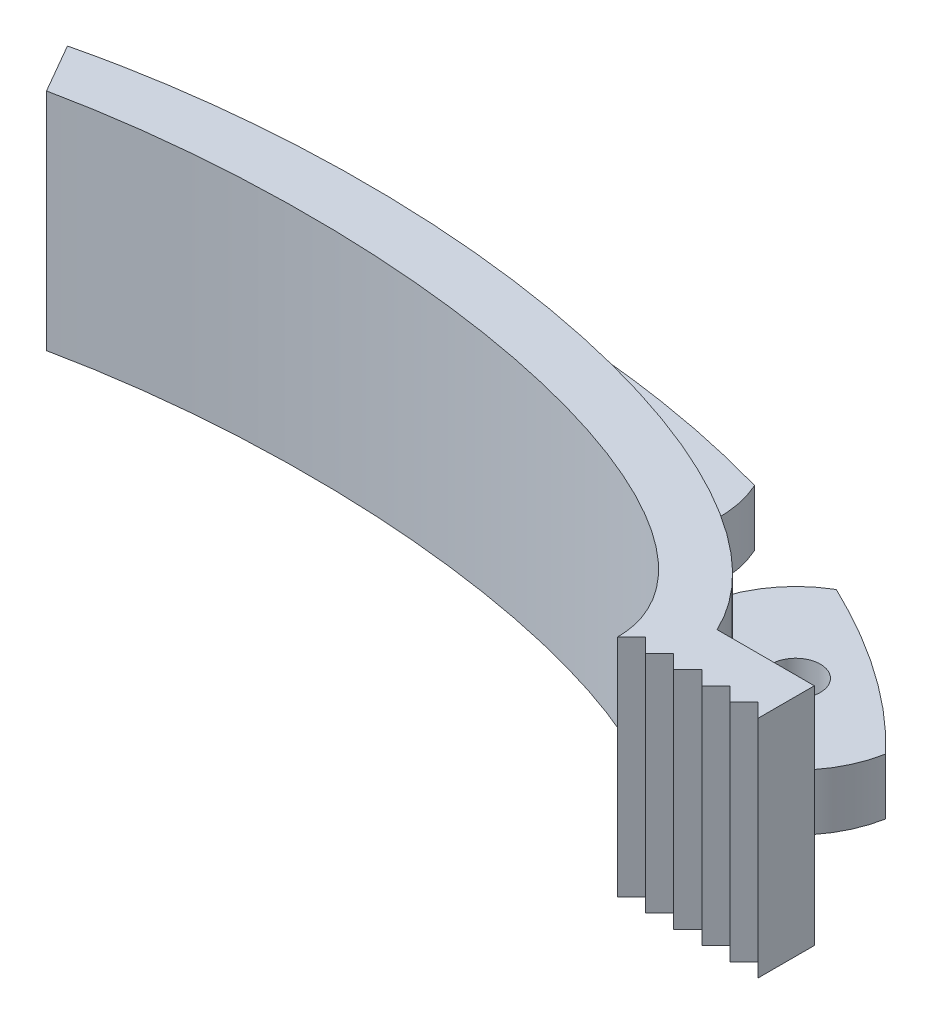
ISO-10303-21;
HEADER;
FILE_DESCRIPTION(('STEP AP214'),'2;1');
FILE_NAME('part.step','',(''),(''),'','','');
FILE_SCHEMA(('AUTOMOTIVE_DESIGN { 1 0 10303 214 1 1 1 1 }'));
ENDSEC;
DATA;
#1=APPLICATION_CONTEXT('core data for automotive mechanical design processes');
#2=APPLICATION_PROTOCOL_DEFINITION('international standard','automotive_design',2000,#1);
#3=PRODUCT_CONTEXT('',#1,'mechanical');
#4=PRODUCT('Part','Part','',(#3));
#5=PRODUCT_RELATED_PRODUCT_CATEGORY('part','',(#4));
#6=PRODUCT_DEFINITION_FORMATION('','',#4);
#7=PRODUCT_DEFINITION_CONTEXT('part definition',#1,'design');
#8=PRODUCT_DEFINITION('design','',#6,#7);
#9=PRODUCT_DEFINITION_SHAPE('','',#8);
#10=(LENGTH_UNIT() NAMED_UNIT(*) SI_UNIT(.MILLI.,.METRE.));
#11=(NAMED_UNIT(*) PLANE_ANGLE_UNIT() SI_UNIT($,.RADIAN.));
#12=(NAMED_UNIT(*) SI_UNIT($,.STERADIAN.) SOLID_ANGLE_UNIT());
#13=UNCERTAINTY_MEASURE_WITH_UNIT(LENGTH_MEASURE(1.E-05),#10,'distance_accuracy_value','');
#14=(GEOMETRIC_REPRESENTATION_CONTEXT(3) GLOBAL_UNCERTAINTY_ASSIGNED_CONTEXT((#13)) GLOBAL_UNIT_ASSIGNED_CONTEXT((#10,
#11,#12)) REPRESENTATION_CONTEXT('',''));
#15=CARTESIAN_POINT('',(0.,0.,0.));
#16=DIRECTION('',(0.,0.,1.));
#17=DIRECTION('',(1.,0.,0.));
#18=AXIS2_PLACEMENT_3D('',#15,#16,#17);
#19=CARTESIAN_POINT('',(0.,0.,0.));
#20=DIRECTION('',(0.,-1.,0.));
#21=DIRECTION('',(-1.,0.,0.));
#22=AXIS2_PLACEMENT_3D('',#19,#20,#21);
#23=ELLIPSE('',#22,37.,15.);
#24=DIRECTION('',(0.,1.,0.));
#25=VECTOR('',#24,1.);
#26=SURFACE_OF_LINEAR_EXTRUSION('',#23,#25);
#27=DIRECTION('',(0.,1.,0.));
#28=VECTOR('',#27,1.);
#29=CARTESIAN_POINT('',(37.,0.,0.));
#30=LINE('',#29,#28);
#31=CARTESIAN_POINT('',(37.,0.,0.));
#32=VERTEX_POINT('',#31);
#33=CARTESIAN_POINT('',(37.,16.,0.));
#34=VERTEX_POINT('',#33);
#35=EDGE_CURVE('E48',#32,#34,#30,.T.);
#36=ORIENTED_EDGE('',*,*,#35,.T.);
#37=CARTESIAN_POINT('',(0.,16.,0.));
#38=DIRECTION('',(0.,-1.,0.));
#39=DIRECTION('',(-1.,0.,0.));
#40=AXIS2_PLACEMENT_3D('',#37,#38,#39);
#41=ELLIPSE('',#40,37.,15.);
#42=CARTESIAN_POINT('',(-16.9426962670588,16.,-13.3349728492983));
#43=VERTEX_POINT('',#42);
#44=EDGE_CURVE('E151',#43,#34,#41,.T.);
#45=ORIENTED_EDGE('',*,*,#44,.F.);
#46=DIRECTION('',(0.,1.,0.));
#47=VECTOR('',#46,1.);
#48=CARTESIAN_POINT('',(-16.9426962670588,0.,-13.3349728492983));
#49=LINE('',#48,#47);
#50=CARTESIAN_POINT('',(-16.9426962670588,0.,-13.3349728492983));
#51=VERTEX_POINT('',#50);
#52=EDGE_CURVE('E12',#51,#43,#49,.T.);
#53=ORIENTED_EDGE('',*,*,#52,.F.);
#54=EDGE_CURVE('E152',#51,#32,#23,.T.);
#55=ORIENTED_EDGE('',*,*,#54,.T.);
#56=EDGE_LOOP('',(#36,#45,#53,#55));
#57=FACE_BOUND('',#56,.T.);
#58=ADVANCED_FACE('F44',(#57),#26,.T.);
#59=CARTESIAN_POINT('',(-18.9654025149489,0.,-16.8450646295108));
#60=DIRECTION('',(-0.866436212573038,0.,0.49928778228802));
#61=DIRECTION('',(0.49928778228802,0.,0.866436212573038));
#62=AXIS2_PLACEMENT_3D('',#59,#60,#61);
#63=PLANE('',#62);
#64=ORIENTED_EDGE('',*,*,#52,.T.);
#65=DIRECTION('',(0.49928778228802,0.,0.866436212573038));
#66=VECTOR('',#65,1.);
#67=CARTESIAN_POINT('',(-18.9654025149489,16.,-16.8450646295108));
#68=LINE('',#67,#66);
#69=CARTESIAN_POINT('',(-18.9654025149489,16.,-16.8450646295108));
#70=VERTEX_POINT('',#69);
#71=EDGE_CURVE('E169',#70,#43,#68,.T.);
#72=ORIENTED_EDGE('',*,*,#71,.F.);
#73=DIRECTION('',(0.,1.,0.));
#74=VECTOR('',#73,1.);
#75=CARTESIAN_POINT('',(-18.9654025149489,0.,-16.8450646295108));
#76=LINE('',#75,#74);
#77=CARTESIAN_POINT('',(-18.9654025149489,0.,-16.8450646295108));
#78=VERTEX_POINT('',#77);
#79=EDGE_CURVE('E53',#78,#70,#76,.T.);
#80=ORIENTED_EDGE('',*,*,#79,.F.);
#81=DIRECTION('',(0.49928778228802,0.,0.866436212573038));
#82=VECTOR('',#81,1.);
#83=CARTESIAN_POINT('',(-18.9654025149489,0.,-16.8450646295108));
#84=LINE('',#83,#82);
#85=EDGE_CURVE('E157',#78,#51,#84,.T.);
#86=ORIENTED_EDGE('',*,*,#85,.T.);
#87=EDGE_LOOP('',(#64,#72,#80,#86));
#88=FACE_BOUND('',#87,.T.);
#89=ADVANCED_FACE('F251',(#88),#63,.T.);
#90=CARTESIAN_POINT('',(0.,0.,0.));
#91=DIRECTION('',(0.,1.,0.));
#92=DIRECTION('',(-1.,0.,0.));
#93=AXIS2_PLACEMENT_3D('',#90,#91,#92);
#94=ELLIPSE('',#93,41.,19.);
#95=DIRECTION('',(0.,1.,0.));
#96=VECTOR('',#95,1.);
#97=SURFACE_OF_LINEAR_EXTRUSION('',#94,#96);
#98=ORIENTED_EDGE('',*,*,#79,.T.);
#99=CARTESIAN_POINT('',(0.,16.,0.));
#100=DIRECTION('',(0.,1.,0.));
#101=DIRECTION('',(-1.,0.,0.));
#102=AXIS2_PLACEMENT_3D('',#99,#100,#101);
#103=ELLIPSE('',#102,41.,19.);
#104=CARTESIAN_POINT('',(40.0811158137513,16.,-4.));
#105=VERTEX_POINT('',#104);
#106=EDGE_CURVE('E203',#105,#70,#103,.T.);
#107=ORIENTED_EDGE('',*,*,#106,.F.);
#108=DIRECTION('',(0.,1.,0.));
#109=VECTOR('',#108,1.);
#110=CARTESIAN_POINT('',(40.0811158137513,0.,-4.));
#111=LINE('',#110,#109);
#112=CARTESIAN_POINT('',(40.0811158137513,0.,-4.));
#113=VERTEX_POINT('',#112);
#114=EDGE_CURVE('E335',#113,#105,#111,.T.);
#115=ORIENTED_EDGE('',*,*,#114,.F.);
#116=EDGE_CURVE('E242',#113,#78,#94,.T.);
#117=ORIENTED_EDGE('',*,*,#116,.T.);
#118=EDGE_LOOP('',(#98,#107,#115,#117));
#119=FACE_BOUND('',#118,.T.);
#120=ADVANCED_FACE('F246',(#119),#97,.T.);
#121=CARTESIAN_POINT('',(47.,0.,-4.));
#122=DIRECTION('',(0.,0.,-1.));
#123=DIRECTION('',(-1.,0.,0.));
#124=AXIS2_PLACEMENT_3D('',#121,#122,#123);
#125=PLANE('',#124);
#126=ORIENTED_EDGE('',*,*,#114,.T.);
#127=DIRECTION('',(-1.,0.,0.));
#128=VECTOR('',#127,1.);
#129=CARTESIAN_POINT('',(47.,16.,-4.));
#130=LINE('',#129,#128);
#131=CARTESIAN_POINT('',(47.,16.,-4.));
#132=VERTEX_POINT('',#131);
#133=EDGE_CURVE('E200',#132,#105,#130,.T.);
#134=ORIENTED_EDGE('',*,*,#133,.F.);
#135=DIRECTION('',(0.,1.,0.));
#136=VECTOR('',#135,1.);
#137=CARTESIAN_POINT('',(47.,0.,-4.));
#138=LINE('',#137,#136);
#139=CARTESIAN_POINT('',(47.,0.,-4.));
#140=VERTEX_POINT('',#139);
#141=EDGE_CURVE('E333',#140,#132,#138,.T.);
#142=ORIENTED_EDGE('',*,*,#141,.F.);
#143=DIRECTION('',(-1.,0.,0.));
#144=VECTOR('',#143,1.);
#145=CARTESIAN_POINT('',(47.,0.,-4.));
#146=LINE('',#145,#144);
#147=EDGE_CURVE('E239',#140,#113,#146,.T.);
#148=ORIENTED_EDGE('',*,*,#147,.T.);
#149=EDGE_LOOP('',(#126,#134,#142,#148));
#150=FACE_BOUND('',#149,.T.);
#151=ADVANCED_FACE('F250',(#150),#125,.T.);
#152=CARTESIAN_POINT('',(47.,0.,0.));
#153=DIRECTION('',(1.,0.,0.));
#154=DIRECTION('',(0.,0.,-1.));
#155=AXIS2_PLACEMENT_3D('',#152,#153,#154);
#156=PLANE('',#155);
#157=ORIENTED_EDGE('',*,*,#141,.T.);
#158=DIRECTION('',(0.,0.,-1.));
#159=VECTOR('',#158,1.);
#160=CARTESIAN_POINT('',(47.,16.,0.));
#161=LINE('',#160,#159);
#162=CARTESIAN_POINT('',(47.,16.,0.));
#163=VERTEX_POINT('',#162);
#164=EDGE_CURVE('E197',#163,#132,#161,.T.);
#165=ORIENTED_EDGE('',*,*,#164,.F.);
#166=DIRECTION('',(0.,1.,0.));
#167=VECTOR('',#166,1.);
#168=CARTESIAN_POINT('',(47.,0.,0.));
#169=LINE('',#168,#167);
#170=CARTESIAN_POINT('',(47.,0.,0.));
#171=VERTEX_POINT('',#170);
#172=EDGE_CURVE('E331',#171,#163,#169,.T.);
#173=ORIENTED_EDGE('',*,*,#172,.F.);
#174=DIRECTION('',(0.,0.,-1.));
#175=VECTOR('',#174,1.);
#176=CARTESIAN_POINT('',(47.,0.,0.));
#177=LINE('',#176,#175);
#178=EDGE_CURVE('E236',#171,#140,#177,.T.);
#179=ORIENTED_EDGE('',*,*,#178,.T.);
#180=EDGE_LOOP('',(#157,#165,#173,#179));
#181=FACE_BOUND('',#180,.T.);
#182=ADVANCED_FACE('F256',(#181),#156,.T.);
#183=CARTESIAN_POINT('',(47.,0.,0.));
#184=DIRECTION('',(-0.707106781186547,0.,0.707106781186548));
#185=DIRECTION('',(0.707106781186548,0.,0.707106781186547));
#186=AXIS2_PLACEMENT_3D('',#183,#184,#185);
#187=PLANE('',#186);
#188=ORIENTED_EDGE('',*,*,#172,.T.);
#189=DIRECTION('',(0.707106781186548,0.,0.707106781186547));
#190=VECTOR('',#189,1.);
#191=CARTESIAN_POINT('',(47.,16.,0.));
#192=LINE('',#191,#190);
#193=CARTESIAN_POINT('',(46.,16.,-1.));
#194=VERTEX_POINT('',#193);
#195=EDGE_CURVE('E194',#194,#163,#192,.T.);
#196=ORIENTED_EDGE('',*,*,#195,.F.);
#197=DIRECTION('',(0.,1.,0.));
#198=VECTOR('',#197,1.);
#199=CARTESIAN_POINT('',(46.,0.,-1.));
#200=LINE('',#199,#198);
#201=CARTESIAN_POINT('',(46.,0.,-1.));
#202=VERTEX_POINT('',#201);
#203=EDGE_CURVE('E329',#202,#194,#200,.T.);
#204=ORIENTED_EDGE('',*,*,#203,.F.);
#205=DIRECTION('',(0.707106781186548,0.,0.707106781186547));
#206=VECTOR('',#205,1.);
#207=CARTESIAN_POINT('',(47.,0.,0.));
#208=LINE('',#207,#206);
#209=EDGE_CURVE('E233',#202,#171,#208,.T.);
#210=ORIENTED_EDGE('',*,*,#209,.T.);
#211=EDGE_LOOP('',(#188,#196,#204,#210));
#212=FACE_BOUND('',#211,.T.);
#213=ADVANCED_FACE('F260',(#212),#187,.T.);
#214=CARTESIAN_POINT('',(46.,0.,-1.));
#215=DIRECTION('',(0.707106781186542,0.,0.707106781186553));
#216=DIRECTION('',(0.707106781186553,0.,-0.707106781186542));
#217=AXIS2_PLACEMENT_3D('',#214,#215,#216);
#218=PLANE('',#217);
#219=ORIENTED_EDGE('',*,*,#203,.T.);
#220=DIRECTION('',(0.707106781186553,0.,-0.707106781186542));
#221=VECTOR('',#220,1.);
#222=CARTESIAN_POINT('',(46.,16.,-1.));
#223=LINE('',#222,#221);
#224=CARTESIAN_POINT('',(45.,16.,0.));
#225=VERTEX_POINT('',#224);
#226=EDGE_CURVE('E191',#225,#194,#223,.T.);
#227=ORIENTED_EDGE('',*,*,#226,.F.);
#228=DIRECTION('',(0.,1.,0.));
#229=VECTOR('',#228,1.);
#230=CARTESIAN_POINT('',(45.,0.,0.));
#231=LINE('',#230,#229);
#232=CARTESIAN_POINT('',(45.,0.,0.));
#233=VERTEX_POINT('',#232);
#234=EDGE_CURVE('E327',#233,#225,#231,.T.);
#235=ORIENTED_EDGE('',*,*,#234,.F.);
#236=DIRECTION('',(0.707106781186553,0.,-0.707106781186542));
#237=VECTOR('',#236,1.);
#238=CARTESIAN_POINT('',(46.,0.,-1.));
#239=LINE('',#238,#237);
#240=EDGE_CURVE('E230',#233,#202,#239,.T.);
#241=ORIENTED_EDGE('',*,*,#240,.T.);
#242=EDGE_LOOP('',(#219,#227,#235,#241));
#243=FACE_BOUND('',#242,.T.);
#244=ADVANCED_FACE('F264',(#243),#218,.T.);
#245=CARTESIAN_POINT('',(45.,0.,0.));
#246=DIRECTION('',(-0.707106781186547,0.,0.707106781186548));
#247=DIRECTION('',(0.707106781186548,0.,0.707106781186547));
#248=AXIS2_PLACEMENT_3D('',#245,#246,#247);
#249=PLANE('',#248);
#250=ORIENTED_EDGE('',*,*,#234,.T.);
#251=DIRECTION('',(0.707106781186548,0.,0.707106781186547));
#252=VECTOR('',#251,1.);
#253=CARTESIAN_POINT('',(45.,16.,0.));
#254=LINE('',#253,#252);
#255=CARTESIAN_POINT('',(44.,16.,-0.999999999999986));
#256=VERTEX_POINT('',#255);
#257=EDGE_CURVE('E188',#256,#225,#254,.T.);
#258=ORIENTED_EDGE('',*,*,#257,.F.);
#259=DIRECTION('',(0.,1.,0.));
#260=VECTOR('',#259,1.);
#261=CARTESIAN_POINT('',(44.,0.,-0.999999999999986));
#262=LINE('',#261,#260);
#263=CARTESIAN_POINT('',(44.,0.,-0.999999999999986));
#264=VERTEX_POINT('',#263);
#265=EDGE_CURVE('E325',#264,#256,#262,.T.);
#266=ORIENTED_EDGE('',*,*,#265,.F.);
#267=DIRECTION('',(0.707106781186548,0.,0.707106781186547));
#268=VECTOR('',#267,1.);
#269=CARTESIAN_POINT('',(45.,0.,0.));
#270=LINE('',#269,#268);
#271=EDGE_CURVE('E227',#264,#233,#270,.T.);
#272=ORIENTED_EDGE('',*,*,#271,.T.);
#273=EDGE_LOOP('',(#250,#258,#266,#272));
#274=FACE_BOUND('',#273,.T.);
#275=ADVANCED_FACE('F268',(#274),#249,.T.);
#276=CARTESIAN_POINT('',(44.,0.,-0.999999999999986));
#277=DIRECTION('',(0.707106781186547,0.,0.707106781186548));
#278=DIRECTION('',(0.707106781186548,0.,-0.707106781186547));
#279=AXIS2_PLACEMENT_3D('',#276,#277,#278);
#280=PLANE('',#279);
#281=ORIENTED_EDGE('',*,*,#265,.T.);
#282=DIRECTION('',(0.707106781186548,0.,-0.707106781186547));
#283=VECTOR('',#282,1.);
#284=CARTESIAN_POINT('',(44.,16.,-0.999999999999986));
#285=LINE('',#284,#283);
#286=CARTESIAN_POINT('',(43.,16.,0.));
#287=VERTEX_POINT('',#286);
#288=EDGE_CURVE('E185',#287,#256,#285,.T.);
#289=ORIENTED_EDGE('',*,*,#288,.F.);
#290=DIRECTION('',(0.,1.,0.));
#291=VECTOR('',#290,1.);
#292=CARTESIAN_POINT('',(43.,0.,0.));
#293=LINE('',#292,#291);
#294=CARTESIAN_POINT('',(43.,0.,0.));
#295=VERTEX_POINT('',#294);
#296=EDGE_CURVE('E323',#295,#287,#293,.T.);
#297=ORIENTED_EDGE('',*,*,#296,.F.);
#298=DIRECTION('',(0.707106781186548,0.,-0.707106781186547));
#299=VECTOR('',#298,1.);
#300=CARTESIAN_POINT('',(44.,0.,-0.999999999999986));
#301=LINE('',#300,#299);
#302=EDGE_CURVE('E224',#295,#264,#301,.T.);
#303=ORIENTED_EDGE('',*,*,#302,.T.);
#304=EDGE_LOOP('',(#281,#289,#297,#303));
#305=FACE_BOUND('',#304,.T.);
#306=ADVANCED_FACE('F272',(#305),#280,.T.);
#307=CARTESIAN_POINT('',(43.,0.,0.));
#308=DIRECTION('',(-0.707106781186542,0.,0.707106781186553));
#309=DIRECTION('',(0.707106781186553,0.,0.707106781186542));
#310=AXIS2_PLACEMENT_3D('',#307,#308,#309);
#311=PLANE('',#310);
#312=ORIENTED_EDGE('',*,*,#296,.T.);
#313=DIRECTION('',(0.707106781186553,0.,0.707106781186542));
#314=VECTOR('',#313,1.);
#315=CARTESIAN_POINT('',(43.,16.,0.));
#316=LINE('',#315,#314);
#317=CARTESIAN_POINT('',(42.,16.,-0.999999999999972));
#318=VERTEX_POINT('',#317);
#319=EDGE_CURVE('E182',#318,#287,#316,.T.);
#320=ORIENTED_EDGE('',*,*,#319,.F.);
#321=DIRECTION('',(0.,1.,0.));
#322=VECTOR('',#321,1.);
#323=CARTESIAN_POINT('',(42.,0.,-0.999999999999972));
#324=LINE('',#323,#322);
#325=CARTESIAN_POINT('',(42.,0.,-0.999999999999972));
#326=VERTEX_POINT('',#325);
#327=EDGE_CURVE('E321',#326,#318,#324,.T.);
#328=ORIENTED_EDGE('',*,*,#327,.F.);
#329=DIRECTION('',(0.707106781186553,0.,0.707106781186542));
#330=VECTOR('',#329,1.);
#331=CARTESIAN_POINT('',(43.,0.,0.));
#332=LINE('',#331,#330);
#333=EDGE_CURVE('E221',#326,#295,#332,.T.);
#334=ORIENTED_EDGE('',*,*,#333,.T.);
#335=EDGE_LOOP('',(#312,#320,#328,#334));
#336=FACE_BOUND('',#335,.T.);
#337=ADVANCED_FACE('F276',(#336),#311,.T.);
#338=CARTESIAN_POINT('',(42.,0.,-0.999999999999972));
#339=DIRECTION('',(0.707106781186547,0.,0.707106781186548));
#340=DIRECTION('',(0.707106781186548,0.,-0.707106781186547));
#341=AXIS2_PLACEMENT_3D('',#338,#339,#340);
#342=PLANE('',#341);
#343=ORIENTED_EDGE('',*,*,#327,.T.);
#344=DIRECTION('',(0.707106781186548,0.,-0.707106781186547));
#345=VECTOR('',#344,1.);
#346=CARTESIAN_POINT('',(42.,16.,-0.999999999999972));
#347=LINE('',#346,#345);
#348=CARTESIAN_POINT('',(41.,16.,0.));
#349=VERTEX_POINT('',#348);
#350=EDGE_CURVE('E179',#349,#318,#347,.T.);
#351=ORIENTED_EDGE('',*,*,#350,.F.);
#352=DIRECTION('',(0.,1.,0.));
#353=VECTOR('',#352,1.);
#354=CARTESIAN_POINT('',(41.,0.,0.));
#355=LINE('',#354,#353);
#356=CARTESIAN_POINT('',(41.,0.,0.));
#357=VERTEX_POINT('',#356);
#358=EDGE_CURVE('E319',#357,#349,#355,.T.);
#359=ORIENTED_EDGE('',*,*,#358,.F.);
#360=DIRECTION('',(0.707106781186548,0.,-0.707106781186547));
#361=VECTOR('',#360,1.);
#362=CARTESIAN_POINT('',(42.,0.,-0.999999999999972));
#363=LINE('',#362,#361);
#364=EDGE_CURVE('E218',#357,#326,#363,.T.);
#365=ORIENTED_EDGE('',*,*,#364,.T.);
#366=EDGE_LOOP('',(#343,#351,#359,#365));
#367=FACE_BOUND('',#366,.T.);
#368=ADVANCED_FACE('F280',(#367),#342,.T.);
#369=CARTESIAN_POINT('',(41.,0.,0.));
#370=DIRECTION('',(-0.707106781186545,0.,0.70710678118655));
#371=DIRECTION('',(0.70710678118655,0.,0.707106781186545));
#372=AXIS2_PLACEMENT_3D('',#369,#370,#371);
#373=PLANE('',#372);
#374=ORIENTED_EDGE('',*,*,#358,.T.);
#375=DIRECTION('',(0.70710678118655,0.,0.707106781186545));
#376=VECTOR('',#375,1.);
#377=CARTESIAN_POINT('',(41.,16.,0.));
#378=LINE('',#377,#376);
#379=CARTESIAN_POINT('',(40.,16.,-0.999999999999958));
#380=VERTEX_POINT('',#379);
#381=EDGE_CURVE('E176',#380,#349,#378,.T.);
#382=ORIENTED_EDGE('',*,*,#381,.F.);
#383=DIRECTION('',(0.,1.,0.));
#384=VECTOR('',#383,1.);
#385=CARTESIAN_POINT('',(40.,0.,-0.999999999999958));
#386=LINE('',#385,#384);
#387=CARTESIAN_POINT('',(40.,0.,-0.999999999999958));
#388=VERTEX_POINT('',#387);
#389=EDGE_CURVE('E315',#388,#380,#386,.T.);
#390=ORIENTED_EDGE('',*,*,#389,.F.);
#391=DIRECTION('',(0.70710678118655,0.,0.707106781186545));
#392=VECTOR('',#391,1.);
#393=CARTESIAN_POINT('',(41.,0.,0.));
#394=LINE('',#393,#392);
#395=EDGE_CURVE('E215',#388,#357,#394,.T.);
#396=ORIENTED_EDGE('',*,*,#395,.T.);
#397=EDGE_LOOP('',(#374,#382,#390,#396));
#398=FACE_BOUND('',#397,.T.);
#399=ADVANCED_FACE('F284',(#398),#373,.T.);
#400=CARTESIAN_POINT('',(40.,0.,-0.999999999999958));
#401=DIRECTION('',(0.707106781186533,0.,0.707106781186562));
#402=DIRECTION('',(0.707106781186562,0.,-0.707106781186533));
#403=AXIS2_PLACEMENT_3D('',#400,#401,#402);
#404=PLANE('',#403);
#405=ORIENTED_EDGE('',*,*,#389,.T.);
#406=DIRECTION('',(0.707106781186562,0.,-0.707106781186533));
#407=VECTOR('',#406,1.);
#408=CARTESIAN_POINT('',(40.,16.,-0.999999999999958));
#409=LINE('',#408,#407);
#410=CARTESIAN_POINT('',(39.,16.,0.));
#411=VERTEX_POINT('',#410);
#412=EDGE_CURVE('E173',#411,#380,#409,.T.);
#413=ORIENTED_EDGE('',*,*,#412,.F.);
#414=DIRECTION('',(0.,1.,0.));
#415=VECTOR('',#414,1.);
#416=CARTESIAN_POINT('',(39.,0.,0.));
#417=LINE('',#416,#415);
#418=CARTESIAN_POINT('',(39.,0.,0.));
#419=VERTEX_POINT('',#418);
#420=EDGE_CURVE('E314',#419,#411,#417,.T.);
#421=ORIENTED_EDGE('',*,*,#420,.F.);
#422=DIRECTION('',(0.707106781186562,0.,-0.707106781186533));
#423=VECTOR('',#422,1.);
#424=CARTESIAN_POINT('',(40.,0.,-0.999999999999958));
#425=LINE('',#424,#423);
#426=EDGE_CURVE('E212',#419,#388,#425,.T.);
#427=ORIENTED_EDGE('',*,*,#426,.T.);
#428=EDGE_LOOP('',(#405,#413,#421,#427));
#429=FACE_BOUND('',#428,.T.);
#430=ADVANCED_FACE('F288',(#429),#404,.T.);
#431=CARTESIAN_POINT('',(39.,0.,0.));
#432=DIRECTION('',(-0.707106781186533,0.,0.707106781186562));
#433=DIRECTION('',(0.707106781186562,0.,0.707106781186533));
#434=AXIS2_PLACEMENT_3D('',#431,#432,#433);
#435=PLANE('',#434);
#436=ORIENTED_EDGE('',*,*,#420,.T.);
#437=DIRECTION('',(0.707106781186562,0.,0.707106781186533));
#438=VECTOR('',#437,1.);
#439=CARTESIAN_POINT('',(39.,16.,0.));
#440=LINE('',#439,#438);
#441=CARTESIAN_POINT('',(38.,16.,-0.999999999999944));
#442=VERTEX_POINT('',#441);
#443=EDGE_CURVE('E164',#442,#411,#440,.T.);
#444=ORIENTED_EDGE('',*,*,#443,.F.);
#445=DIRECTION('',(0.,1.,0.));
#446=VECTOR('',#445,1.);
#447=CARTESIAN_POINT('',(38.,0.,-0.999999999999944));
#448=LINE('',#447,#446);
#449=CARTESIAN_POINT('',(38.,0.,-0.999999999999944));
#450=VERTEX_POINT('',#449);
#451=EDGE_CURVE('E156',#450,#442,#448,.T.);
#452=ORIENTED_EDGE('',*,*,#451,.F.);
#453=DIRECTION('',(0.707106781186562,0.,0.707106781186533));
#454=VECTOR('',#453,1.);
#455=CARTESIAN_POINT('',(39.,0.,0.));
#456=LINE('',#455,#454);
#457=EDGE_CURVE('E209',#450,#419,#456,.T.);
#458=ORIENTED_EDGE('',*,*,#457,.T.);
#459=EDGE_LOOP('',(#436,#444,#452,#458));
#460=FACE_BOUND('',#459,.T.);
#461=ADVANCED_FACE('F292',(#460),#435,.T.);
#462=CARTESIAN_POINT('',(38.,0.,-0.999999999999944));
#463=DIRECTION('',(0.707106781186527,0.,0.707106781186568));
#464=DIRECTION('',(0.707106781186568,0.,-0.707106781186527));
#465=AXIS2_PLACEMENT_3D('',#462,#463,#464);
#466=PLANE('',#465);
#467=ORIENTED_EDGE('',*,*,#451,.T.);
#468=DIRECTION('',(0.707106781186568,0.,-0.707106781186527));
#469=VECTOR('',#468,1.);
#470=CARTESIAN_POINT('',(38.,16.,-0.999999999999944));
#471=LINE('',#470,#469);
#472=EDGE_CURVE('E159',#34,#442,#471,.T.);
#473=ORIENTED_EDGE('',*,*,#472,.F.);
#474=ORIENTED_EDGE('',*,*,#35,.F.);
#475=DIRECTION('',(0.707106781186568,0.,-0.707106781186527));
#476=VECTOR('',#475,1.);
#477=CARTESIAN_POINT('',(38.,0.,-0.999999999999944));
#478=LINE('',#477,#476);
#479=EDGE_CURVE('E207',#32,#450,#478,.T.);
#480=ORIENTED_EDGE('',*,*,#479,.T.);
#481=EDGE_LOOP('',(#467,#473,#474,#480));
#482=FACE_BOUND('',#481,.T.);
#483=ADVANCED_FACE('F160',(#482),#466,.T.);
#484=CARTESIAN_POINT('',(0.,0.,0.));
#485=DIRECTION('',(0.,1.,0.));
#486=DIRECTION('',(0.,0.,1.));
#487=AXIS2_PLACEMENT_3D('',#484,#485,#486);
#488=PLANE('',#487);
#489=ORIENTED_EDGE('',*,*,#54,.F.);
#490=ORIENTED_EDGE('',*,*,#85,.F.);
#491=ORIENTED_EDGE('',*,*,#116,.F.);
#492=ORIENTED_EDGE('',*,*,#147,.F.);
#493=ORIENTED_EDGE('',*,*,#178,.F.);
#494=ORIENTED_EDGE('',*,*,#209,.F.);
#495=ORIENTED_EDGE('',*,*,#240,.F.);
#496=ORIENTED_EDGE('',*,*,#271,.F.);
#497=ORIENTED_EDGE('',*,*,#302,.F.);
#498=ORIENTED_EDGE('',*,*,#333,.F.);
#499=ORIENTED_EDGE('',*,*,#364,.F.);
#500=ORIENTED_EDGE('',*,*,#395,.F.);
#501=ORIENTED_EDGE('',*,*,#426,.F.);
#502=ORIENTED_EDGE('',*,*,#457,.F.);
#503=ORIENTED_EDGE('',*,*,#479,.F.);
#504=EDGE_LOOP('',(#489,#490,#491,#492,#493,#494,#495,#496,#497,#498,#499,#500,#501,#502,#503));
#505=FACE_BOUND('',#504,.T.);
#506=ADVANCED_FACE('F297',(#505),#488,.F.);
#507=CARTESIAN_POINT('',(0.,16.,0.));
#508=DIRECTION('',(0.,1.,0.));
#509=DIRECTION('',(0.,0.,1.));
#510=AXIS2_PLACEMENT_3D('',#507,#508,#509);
#511=PLANE('',#510);
#512=ORIENTED_EDGE('',*,*,#44,.T.);
#513=ORIENTED_EDGE('',*,*,#472,.T.);
#514=ORIENTED_EDGE('',*,*,#443,.T.);
#515=ORIENTED_EDGE('',*,*,#412,.T.);
#516=ORIENTED_EDGE('',*,*,#381,.T.);
#517=ORIENTED_EDGE('',*,*,#350,.T.);
#518=ORIENTED_EDGE('',*,*,#319,.T.);
#519=ORIENTED_EDGE('',*,*,#288,.T.);
#520=ORIENTED_EDGE('',*,*,#257,.T.);
#521=ORIENTED_EDGE('',*,*,#226,.T.);
#522=ORIENTED_EDGE('',*,*,#195,.T.);
#523=ORIENTED_EDGE('',*,*,#164,.T.);
#524=ORIENTED_EDGE('',*,*,#133,.T.);
#525=ORIENTED_EDGE('',*,*,#106,.T.);
#526=ORIENTED_EDGE('',*,*,#71,.T.);
#527=EDGE_LOOP('',(#512,#513,#514,#515,#516,#517,#518,#519,#520,#521,#522,#523,#524,#525,#526));
#528=FACE_BOUND('',#527,.T.);
#529=ADVANCED_FACE('F167',(#528),#511,.T.);
#530=CLOSED_SHELL('',(#58,#89,#120,#151,#182,#213,#244,#275,#306,#337,#368,#399,#430,#461,#483,
#506,#529));
#531=MANIFOLD_SOLID_BREP('B2',#530);
#532=CARTESIAN_POINT('',(0.,4.,0.));
#533=DIRECTION('',(0.,-1.,0.));
#534=DIRECTION('',(0.,0.,-1.));
#535=AXIS2_PLACEMENT_3D('',#532,#533,#534);
#536=PLANE('',#535);
#537=CARTESIAN_POINT('',(-13.2428140699993,4.,-22.9372268044258));
#538=DIRECTION('',(0.,1.,0.));
#539=DIRECTION('',(0.,0.,1.));
#540=AXIS2_PLACEMENT_3D('',#537,#538,#539);
#541=CIRCLE('',#540,1.7500000000005);
#542=CARTESIAN_POINT('',(-13.2428140699993,4.,-21.1872268044253));
#543=VERTEX_POINT('',#542);
#544=EDGE_CURVE('E655',#543,#543,#541,.T.);
#545=ORIENTED_EDGE('',*,*,#544,.F.);
#546=EDGE_LOOP('',(#545));
#547=FACE_BOUND('',#546,.T.);
#548=CARTESIAN_POINT('',(13.2428140699978,4.,-22.937226804426));
#549=DIRECTION('',(0.,1.,0.));
#550=DIRECTION('',(0.,0.,1.));
#551=AXIS2_PLACEMENT_3D('',#548,#549,#550);
#552=CIRCLE('',#551,1.75000000000102);
#553=CARTESIAN_POINT('',(13.2428140699978,4.,-21.187226804425));
#554=VERTEX_POINT('',#553);
#555=EDGE_CURVE('E661',#554,#554,#552,.T.);
#556=ORIENTED_EDGE('',*,*,#555,.F.);
#557=EDGE_LOOP('',(#556));
#558=FACE_BOUND('',#557,.T.);
#559=CARTESIAN_POINT('',(33.8772499778511,4.,-15.7972211019033));
#560=DIRECTION('',(0.,1.,0.));
#561=DIRECTION('',(0.,0.,1.));
#562=AXIS2_PLACEMENT_3D('',#559,#560,#561);
#563=CIRCLE('',#562,1.75);
#564=CARTESIAN_POINT('',(33.8772499778511,4.,-14.0472211019033));
#565=VERTEX_POINT('',#564);
#566=EDGE_CURVE('E667',#565,#565,#563,.T.);
#567=ORIENTED_EDGE('',*,*,#566,.F.);
#568=EDGE_LOOP('',(#567));
#569=FACE_BOUND('',#568,.T.);
#570=CARTESIAN_POINT('',(0.,4.,0.));
#571=DIRECTION('',(0.,1.,0.));
#572=DIRECTION('',(-1.,0.,0.));
#573=AXIS2_PLACEMENT_3D('',#570,#571,#572);
#574=ELLIPSE('',#573,48.,29.);
#575=CARTESIAN_POINT('',(-7.62399054639596,4.,-28.6318578030764));
#576=VERTEX_POINT('',#575);
#577=CARTESIAN_POINT('',(-20.542771825082,4.,-26.2099346701232));
#578=VERTEX_POINT('',#577);
#579=EDGE_CURVE('E471',#576,#578,#574,.T.);
#580=ORIENTED_EDGE('',*,*,#579,.T.);
#581=CARTESIAN_POINT('',(-13.2428140699993,4.,-22.9372268044258));
#582=DIRECTION('',(0.,1.,0.));
#583=DIRECTION('',(0.,0.,1.));
#584=AXIS2_PLACEMENT_3D('',#581,#582,#583);
#585=CIRCLE('',#584,8.00000000001191);
#586=CARTESIAN_POINT('',(-20.1743037705939,4.,-18.9429245461156));
#587=VERTEX_POINT('',#586);
#588=EDGE_CURVE('E675',#578,#587,#585,.T.);
#589=ORIENTED_EDGE('',*,*,#588,.T.);
#590=DIRECTION('',(0.499287782288033,0.,0.86643621257303));
#591=VECTOR('',#590,1.);
#592=CARTESIAN_POINT('',(-20.17430377059,4.,-18.9429245461178));
#593=LINE('',#592,#591);
#594=CARTESIAN_POINT('',(-18.9654025149477,4.,-16.8450646295111));
#595=VERTEX_POINT('',#594);
#596=EDGE_CURVE('E679',#587,#595,#593,.T.);
#597=ORIENTED_EDGE('',*,*,#596,.T.);
#598=CARTESIAN_POINT('',(0.,4.,0.));
#599=DIRECTION('',(0.,-1.,0.));
#600=DIRECTION('',(-1.,0.,0.));
#601=AXIS2_PLACEMENT_3D('',#598,#599,#600);
#602=ELLIPSE('',#601,41.,19.);
#603=CARTESIAN_POINT('',(40.0811158137513,4.,-4.));
#604=VERTEX_POINT('',#603);
#605=EDGE_CURVE('E681',#595,#604,#602,.T.);
#606=ORIENTED_EDGE('',*,*,#605,.T.);
#607=DIRECTION('',(1.,0.,0.));
#608=VECTOR('',#607,1.);
#609=CARTESIAN_POINT('',(42.2674311780264,4.,-4.));
#610=LINE('',#609,#608);
#611=CARTESIAN_POINT('',(42.2674311780264,4.,-4.));
#612=VERTEX_POINT('',#611);
#613=EDGE_CURVE('E684',#604,#612,#610,.T.);
#614=ORIENTED_EDGE('',*,*,#613,.T.);
#615=CARTESIAN_POINT('',(0.,4.,0.));
#616=DIRECTION('',(0.,1.,0.));
#617=DIRECTION('',(1.,0.,0.));
#618=AXIS2_PLACEMENT_3D('',#615,#616,#617);
#619=ELLIPSE('',#618,43.,21.7626933005116);
#620=CARTESIAN_POINT('',(38.739700818397,4.,-9.44453884766806));
#621=VERTEX_POINT('',#620);
#622=EDGE_CURVE('E757',#612,#621,#619,.T.);
#623=ORIENTED_EDGE('',*,*,#622,.T.);
#624=CARTESIAN_POINT('',(33.8772499778511,4.,-15.7972211019033));
#625=DIRECTION('',(0.,1.,0.));
#626=DIRECTION('',(0.,0.,1.));
#627=AXIS2_PLACEMENT_3D('',#624,#625,#626);
#628=CIRCLE('',#627,8.00000000000002);
#629=CARTESIAN_POINT('',(41.7397026657055,4.,-14.3201165926515));
#630=VERTEX_POINT('',#629);
#631=EDGE_CURVE('E733',#621,#630,#628,.T.);
#632=ORIENTED_EDGE('',*,*,#631,.T.);
#633=CARTESIAN_POINT('',(29.8507146175605,4.,-22.7100362297893));
#634=VERTEX_POINT('',#633);
#635=EDGE_CURVE('E479',#630,#634,#574,.T.);
#636=ORIENTED_EDGE('',*,*,#635,.T.);
#637=CARTESIAN_POINT('',(26.0243711127735,4.,-17.324405940231));
#638=VERTEX_POINT('',#637);
#639=EDGE_CURVE('E646',#634,#638,#628,.T.);
#640=ORIENTED_EDGE('',*,*,#639,.T.);
#641=CARTESIAN_POINT('',(0.,4.,0.));
#642=DIRECTION('',(0.,1.,0.));
#643=DIRECTION('',(1.,0.,0.));
#644=AXIS2_PLACEMENT_3D('',#641,#642,#643);
#645=ELLIPSE('',#644,43.,21.7626933005116);
#646=CARTESIAN_POINT('',(20.3071785796751,4.,-19.1829287242614));
#647=VERTEX_POINT('',#646);
#648=EDGE_CURVE('E641',#638,#647,#645,.T.);
#649=ORIENTED_EDGE('',*,*,#648,.T.);
#650=CARTESIAN_POINT('',(13.2428140699978,4.,-22.937226804426));
#651=DIRECTION('',(0.,1.,0.));
#652=DIRECTION('',(0.,0.,1.));
#653=AXIS2_PLACEMENT_3D('',#650,#651,#652);
#654=CIRCLE('',#653,8.00000000001938);
#655=CARTESIAN_POINT('',(20.5427718250896,4.,-26.2099346701215));
#656=VERTEX_POINT('',#655);
#657=EDGE_CURVE('E602',#647,#656,#654,.T.);
#658=ORIENTED_EDGE('',*,*,#657,.T.);
#659=CARTESIAN_POINT('',(7.62399054638507,4.,-28.6318578030774));
#660=VERTEX_POINT('',#659);
#661=EDGE_CURVE('E629',#656,#660,#574,.T.);
#662=ORIENTED_EDGE('',*,*,#661,.T.);
#663=CARTESIAN_POINT('',(5.35652629407962,4.,-21.593178771165));
#664=VERTEX_POINT('',#663);
#665=EDGE_CURVE('E732',#660,#664,#654,.T.);
#666=ORIENTED_EDGE('',*,*,#665,.T.);
#667=CARTESIAN_POINT('',(0.,4.,0.));
#668=DIRECTION('',(0.,1.,0.));
#669=DIRECTION('',(1.,0.,0.));
#670=AXIS2_PLACEMENT_3D('',#667,#668,#669);
#671=ELLIPSE('',#670,43.,21.7626933005116);
#672=CARTESIAN_POINT('',(-5.35652629408854,4.,-21.5931787711655));
#673=VERTEX_POINT('',#672);
#674=EDGE_CURVE('E597',#664,#673,#671,.T.);
#675=ORIENTED_EDGE('',*,*,#674,.T.);
#676=EDGE_CURVE('E676',#673,#576,#585,.T.);
#677=ORIENTED_EDGE('',*,*,#676,.T.);
#678=EDGE_LOOP('',(#580,#589,#597,#606,#614,#623,#632,#636,#640,#649,#658,#662,#666,#675,#677));
#679=FACE_BOUND('',#678,.T.);
#680=ADVANCED_FACE('F455',(#547,#558,#569,#679),#536,.F.);
#681=CARTESIAN_POINT('',(0.,0.,0.));
#682=DIRECTION('',(0.,-1.,0.));
#683=DIRECTION('',(0.,0.,-1.));
#684=AXIS2_PLACEMENT_3D('',#681,#682,#683);
#685=PLANE('',#684);
#686=CARTESIAN_POINT('',(13.2428140699978,0.,-22.937226804426));
#687=DIRECTION('',(0.,1.,0.));
#688=DIRECTION('',(0.,0.,1.));
#689=AXIS2_PLACEMENT_3D('',#686,#687,#688);
#690=CIRCLE('',#689,1.75000000000102);
#691=CARTESIAN_POINT('',(13.2428140699978,0.,-21.187226804425));
#692=VERTEX_POINT('',#691);
#693=EDGE_CURVE('E658',#692,#692,#690,.T.);
#694=ORIENTED_EDGE('',*,*,#693,.T.);
#695=EDGE_LOOP('',(#694));
#696=FACE_BOUND('',#695,.T.);
#697=CARTESIAN_POINT('',(33.8772499778511,0.,-15.7972211019033));
#698=DIRECTION('',(0.,1.,0.));
#699=DIRECTION('',(0.,0.,1.));
#700=AXIS2_PLACEMENT_3D('',#697,#698,#699);
#701=CIRCLE('',#700,1.75);
#702=CARTESIAN_POINT('',(33.8772499778511,0.,-14.0472211019033));
#703=VERTEX_POINT('',#702);
#704=EDGE_CURVE('E664',#703,#703,#701,.T.);
#705=ORIENTED_EDGE('',*,*,#704,.T.);
#706=EDGE_LOOP('',(#705));
#707=FACE_BOUND('',#706,.T.);
#708=CARTESIAN_POINT('',(-13.2428140699993,0.,-22.9372268044258));
#709=DIRECTION('',(0.,1.,0.));
#710=DIRECTION('',(0.,0.,1.));
#711=AXIS2_PLACEMENT_3D('',#708,#709,#710);
#712=CIRCLE('',#711,1.7500000000005);
#713=CARTESIAN_POINT('',(-13.2428140699993,0.,-21.1872268044253));
#714=VERTEX_POINT('',#713);
#715=EDGE_CURVE('E654',#714,#714,#712,.T.);
#716=ORIENTED_EDGE('',*,*,#715,.T.);
#717=EDGE_LOOP('',(#716));
#718=FACE_BOUND('',#717,.T.);
#719=CARTESIAN_POINT('',(-13.2428140699993,0.,-22.9372268044258));
#720=DIRECTION('',(0.,1.,0.));
#721=DIRECTION('',(0.,0.,1.));
#722=AXIS2_PLACEMENT_3D('',#719,#720,#721);
#723=CIRCLE('',#722,8.00000000001191);
#724=CARTESIAN_POINT('',(-20.542771825082,0.,-26.2099346701232));
#725=VERTEX_POINT('',#724);
#726=CARTESIAN_POINT('',(-20.1743037705939,0.,-18.9429245461156));
#727=VERTEX_POINT('',#726);
#728=EDGE_CURVE('E737',#725,#727,#723,.T.);
#729=ORIENTED_EDGE('',*,*,#728,.F.);
#730=CARTESIAN_POINT('',(0.,0.,0.));
#731=DIRECTION('',(0.,1.,0.));
#732=DIRECTION('',(-1.,0.,0.));
#733=AXIS2_PLACEMENT_3D('',#730,#731,#732);
#734=ELLIPSE('',#733,48.,29.);
#735=CARTESIAN_POINT('',(-7.62399054639595,0.,-28.6318578030763));
#736=VERTEX_POINT('',#735);
#737=EDGE_CURVE('E581',#736,#725,#734,.T.);
#738=ORIENTED_EDGE('',*,*,#737,.F.);
#739=CARTESIAN_POINT('',(-5.35652629408854,0.,-21.5931787711655));
#740=VERTEX_POINT('',#739);
#741=EDGE_CURVE('E738',#740,#736,#723,.T.);
#742=ORIENTED_EDGE('',*,*,#741,.F.);
#743=CARTESIAN_POINT('',(0.,0.,0.));
#744=DIRECTION('',(0.,1.,0.));
#745=DIRECTION('',(1.,0.,0.));
#746=AXIS2_PLACEMENT_3D('',#743,#744,#745);
#747=ELLIPSE('',#746,43.,21.7626933005116);
#748=CARTESIAN_POINT('',(5.35652629407962,0.,-21.593178771165));
#749=VERTEX_POINT('',#748);
#750=EDGE_CURVE('E670',#749,#740,#747,.T.);
#751=ORIENTED_EDGE('',*,*,#750,.F.);
#752=CARTESIAN_POINT('',(13.2428140699978,0.,-22.937226804426));
#753=DIRECTION('',(0.,1.,0.));
#754=DIRECTION('',(0.,0.,1.));
#755=AXIS2_PLACEMENT_3D('',#752,#753,#754);
#756=CIRCLE('',#755,8.00000000001938);
#757=CARTESIAN_POINT('',(7.62399054638507,0.,-28.6318578030774));
#758=VERTEX_POINT('',#757);
#759=EDGE_CURVE('E588',#758,#749,#756,.T.);
#760=ORIENTED_EDGE('',*,*,#759,.F.);
#761=CARTESIAN_POINT('',(20.5427718250896,0.,-26.2099346701211));
#762=VERTEX_POINT('',#761);
#763=EDGE_CURVE('E579',#762,#758,#734,.T.);
#764=ORIENTED_EDGE('',*,*,#763,.F.);
#765=CARTESIAN_POINT('',(20.3071785796751,0.,-19.1829287242614));
#766=VERTEX_POINT('',#765);
#767=EDGE_CURVE('E594',#766,#762,#756,.T.);
#768=ORIENTED_EDGE('',*,*,#767,.F.);
#769=CARTESIAN_POINT('',(0.,0.,0.));
#770=DIRECTION('',(0.,1.,0.));
#771=DIRECTION('',(1.,0.,0.));
#772=AXIS2_PLACEMENT_3D('',#769,#770,#771);
#773=ELLIPSE('',#772,43.,21.7626933005116);
#774=CARTESIAN_POINT('',(26.0243711127735,0.,-17.324405940231));
#775=VERTEX_POINT('',#774);
#776=EDGE_CURVE('E586',#775,#766,#773,.T.);
#777=ORIENTED_EDGE('',*,*,#776,.F.);
#778=CARTESIAN_POINT('',(33.8772499778511,0.,-15.7972211019033));
#779=DIRECTION('',(0.,1.,0.));
#780=DIRECTION('',(0.,0.,1.));
#781=AXIS2_PLACEMENT_3D('',#778,#779,#780);
#782=CIRCLE('',#781,8.00000000000002);
#783=CARTESIAN_POINT('',(29.8507146175605,0.,-22.7100362297893));
#784=VERTEX_POINT('',#783);
#785=EDGE_CURVE('E578',#784,#775,#782,.T.);
#786=ORIENTED_EDGE('',*,*,#785,.F.);
#787=CARTESIAN_POINT('',(41.7397026657055,0.,-14.3201165926515));
#788=VERTEX_POINT('',#787);
#789=EDGE_CURVE('E562',#788,#784,#734,.T.);
#790=ORIENTED_EDGE('',*,*,#789,.F.);
#791=CARTESIAN_POINT('',(38.739700818397,0.,-9.44453884766806));
#792=VERTEX_POINT('',#791);
#793=EDGE_CURVE('E576',#792,#788,#782,.T.);
#794=ORIENTED_EDGE('',*,*,#793,.F.);
#795=CARTESIAN_POINT('',(0.,0.,0.));
#796=DIRECTION('',(0.,1.,0.));
#797=DIRECTION('',(1.,0.,0.));
#798=AXIS2_PLACEMENT_3D('',#795,#796,#797);
#799=ELLIPSE('',#798,43.,21.7626933005116);
#800=CARTESIAN_POINT('',(42.2674311780264,0.,-4.));
#801=VERTEX_POINT('',#800);
#802=EDGE_CURVE('E590',#801,#792,#799,.T.);
#803=ORIENTED_EDGE('',*,*,#802,.F.);
#804=DIRECTION('',(1.,0.,0.));
#805=VECTOR('',#804,1.);
#806=CARTESIAN_POINT('',(42.2674311780264,0.,-4.));
#807=LINE('',#806,#805);
#808=CARTESIAN_POINT('',(40.0811158137513,0.,-4.));
#809=VERTEX_POINT('',#808);
#810=EDGE_CURVE('E744',#809,#801,#807,.T.);
#811=ORIENTED_EDGE('',*,*,#810,.F.);
#812=CARTESIAN_POINT('',(0.,0.,0.));
#813=DIRECTION('',(0.,-1.,0.));
#814=DIRECTION('',(-1.,0.,0.));
#815=AXIS2_PLACEMENT_3D('',#812,#813,#814);
#816=ELLIPSE('',#815,41.,19.);
#817=CARTESIAN_POINT('',(-18.9654025149477,0.,-16.8450646295111));
#818=VERTEX_POINT('',#817);
#819=EDGE_CURVE('E743',#818,#809,#816,.T.);
#820=ORIENTED_EDGE('',*,*,#819,.F.);
#821=DIRECTION('',(0.499287782288033,0.,0.86643621257303));
#822=VECTOR('',#821,1.);
#823=CARTESIAN_POINT('',(-20.17430377059,0.,-18.9429245461178));
#824=LINE('',#823,#822);
#825=EDGE_CURVE('E741',#727,#818,#824,.T.);
#826=ORIENTED_EDGE('',*,*,#825,.F.);
#827=EDGE_LOOP('',(#729,#738,#742,#751,#760,#764,#768,#777,#786,#790,#794,#803,#811,#820,#826));
#828=FACE_BOUND('',#827,.T.);
#829=ADVANCED_FACE('F574',(#696,#707,#718,#828),#685,.T.);
#830=CARTESIAN_POINT('',(-13.2428140699993,4.,-22.9372268044258));
#831=DIRECTION('',(0.,-1.,0.));
#832=DIRECTION('',(0.,0.,-1.));
#833=AXIS2_PLACEMENT_3D('',#830,#831,#832);
#834=CYLINDRICAL_SURFACE('',#833,8.00000000001191);
#835=DIRECTION('',(0.,1.,0.));
#836=VECTOR('',#835,1.);
#837=CARTESIAN_POINT('',(-20.5427718250819,0.,-26.2099346701232));
#838=LINE('',#837,#836);
#839=EDGE_CURVE('E649',#725,#578,#838,.T.);
#840=ORIENTED_EDGE('',*,*,#839,.F.);
#841=ORIENTED_EDGE('',*,*,#728,.T.);
#842=DIRECTION('',(0.,-1.,0.));
#843=VECTOR('',#842,1.);
#844=CARTESIAN_POINT('',(-20.1743037705939,4.,-18.9429245461156));
#845=LINE('',#844,#843);
#846=EDGE_CURVE('E618',#587,#727,#845,.T.);
#847=ORIENTED_EDGE('',*,*,#846,.F.);
#848=ORIENTED_EDGE('',*,*,#588,.F.);
#849=EDGE_LOOP('',(#840,#841,#847,#848));
#850=FACE_BOUND('',#849,.T.);
#851=ADVANCED_FACE('F697',(#850),#834,.T.);
#852=DIRECTION('',(0.,1.,0.));
#853=VECTOR('',#852,1.);
#854=CARTESIAN_POINT('',(-7.62399054639604,0.,-28.6318578030763));
#855=LINE('',#854,#853);
#856=EDGE_CURVE('E647',#576,#736,#855,.F.);
#857=ORIENTED_EDGE('',*,*,#856,.F.);
#858=ORIENTED_EDGE('',*,*,#676,.F.);
#859=DIRECTION('',(0.,-1.,0.));
#860=VECTOR('',#859,1.);
#861=CARTESIAN_POINT('',(-5.35652629408854,4.,-21.5931787711655));
#862=LINE('',#861,#860);
#863=EDGE_CURVE('E621',#673,#740,#862,.T.);
#864=ORIENTED_EDGE('',*,*,#863,.T.);
#865=ORIENTED_EDGE('',*,*,#741,.T.);
#866=EDGE_LOOP('',(#857,#858,#864,#865));
#867=FACE_BOUND('',#866,.T.);
#868=ADVANCED_FACE('F699',(#867),#834,.T.);
#869=CARTESIAN_POINT('',(33.8772499778511,4.,-15.7972211019033));
#870=DIRECTION('',(0.,-1.,0.));
#871=DIRECTION('',(0.,0.,-1.));
#872=AXIS2_PLACEMENT_3D('',#869,#870,#871);
#873=CYLINDRICAL_SURFACE('',#872,8.00000000000002);
#874=DIRECTION('',(0.,1.,0.));
#875=VECTOR('',#874,1.);
#876=CARTESIAN_POINT('',(29.8507146175605,0.,-22.7100362297894));
#877=LINE('',#876,#875);
#878=EDGE_CURVE('E568',#784,#634,#877,.T.);
#879=ORIENTED_EDGE('',*,*,#878,.F.);
#880=ORIENTED_EDGE('',*,*,#785,.T.);
#881=DIRECTION('',(0.,-1.,0.));
#882=VECTOR('',#881,1.);
#883=CARTESIAN_POINT('',(26.0243711127735,4.,-17.324405940231));
#884=LINE('',#883,#882);
#885=EDGE_CURVE('E605',#638,#775,#884,.T.);
#886=ORIENTED_EDGE('',*,*,#885,.F.);
#887=ORIENTED_EDGE('',*,*,#639,.F.);
#888=EDGE_LOOP('',(#879,#880,#886,#887));
#889=FACE_BOUND('',#888,.T.);
#890=ADVANCED_FACE('F645',(#889),#873,.T.);
#891=DIRECTION('',(0.,1.,0.));
#892=VECTOR('',#891,1.);
#893=CARTESIAN_POINT('',(41.7397026657055,0.,-14.3201165926515));
#894=LINE('',#893,#892);
#895=EDGE_CURVE('E559',#630,#788,#894,.F.);
#896=ORIENTED_EDGE('',*,*,#895,.F.);
#897=ORIENTED_EDGE('',*,*,#631,.F.);
#898=DIRECTION('',(0.,-1.,0.));
#899=VECTOR('',#898,1.);
#900=CARTESIAN_POINT('',(38.739700818397,4.,-9.44453884766806));
#901=LINE('',#900,#899);
#902=EDGE_CURVE('E585',#621,#792,#901,.T.);
#903=ORIENTED_EDGE('',*,*,#902,.T.);
#904=ORIENTED_EDGE('',*,*,#793,.T.);
#905=EDGE_LOOP('',(#896,#897,#903,#904));
#906=FACE_BOUND('',#905,.T.);
#907=ADVANCED_FACE('F583',(#906),#873,.T.);
#908=CARTESIAN_POINT('',(13.2428140699978,4.,-22.937226804426));
#909=DIRECTION('',(0.,-1.,0.));
#910=DIRECTION('',(0.,0.,-1.));
#911=AXIS2_PLACEMENT_3D('',#908,#909,#910);
#912=CYLINDRICAL_SURFACE('',#911,8.00000000001938);
#913=DIRECTION('',(0.,1.,0.));
#914=VECTOR('',#913,1.);
#915=CARTESIAN_POINT('',(7.62399054638561,0.,-28.6318578030773));
#916=LINE('',#915,#914);
#917=EDGE_CURVE('E42',#758,#660,#916,.T.);
#918=ORIENTED_EDGE('',*,*,#917,.F.);
#919=ORIENTED_EDGE('',*,*,#759,.T.);
#920=DIRECTION('',(0.,-1.,0.));
#921=VECTOR('',#920,1.);
#922=CARTESIAN_POINT('',(5.35652629407962,4.,-21.593178771165));
#923=LINE('',#922,#921);
#924=EDGE_CURVE('E598',#664,#749,#923,.T.);
#925=ORIENTED_EDGE('',*,*,#924,.F.);
#926=ORIENTED_EDGE('',*,*,#665,.F.);
#927=EDGE_LOOP('',(#918,#919,#925,#926));
#928=FACE_BOUND('',#927,.T.);
#929=ADVANCED_FACE('F721',(#928),#912,.T.);
#930=DIRECTION('',(0.,1.,0.));
#931=VECTOR('',#930,1.);
#932=CARTESIAN_POINT('',(20.542771825089,0.,-26.2099346701212));
#933=LINE('',#932,#931);
#934=EDGE_CURVE('E464',#656,#762,#933,.F.);
#935=ORIENTED_EDGE('',*,*,#934,.F.);
#936=ORIENTED_EDGE('',*,*,#657,.F.);
#937=DIRECTION('',(0.,-1.,0.));
#938=VECTOR('',#937,1.);
#939=CARTESIAN_POINT('',(20.3071785796751,4.,-19.1829287242614));
#940=LINE('',#939,#938);
#941=EDGE_CURVE('E601',#647,#766,#940,.T.);
#942=ORIENTED_EDGE('',*,*,#941,.T.);
#943=ORIENTED_EDGE('',*,*,#767,.T.);
#944=EDGE_LOOP('',(#935,#936,#942,#943));
#945=FACE_BOUND('',#944,.T.);
#946=ADVANCED_FACE('F636',(#945),#912,.T.);
#947=DIRECTION('',(0.,-1.,0.));
#948=VECTOR('',#947,1.);
#949=SURFACE_OF_LINEAR_EXTRUSION('',#671,#948);
#950=ORIENTED_EDGE('',*,*,#750,.T.);
#951=ORIENTED_EDGE('',*,*,#863,.F.);
#952=ORIENTED_EDGE('',*,*,#674,.F.);
#953=ORIENTED_EDGE('',*,*,#924,.T.);
#954=EDGE_LOOP('',(#950,#951,#952,#953));
#955=FACE_BOUND('',#954,.T.);
#956=ADVANCED_FACE('F457',(#955),#949,.F.);
#957=CARTESIAN_POINT('',(-20.17430377059,4.,-18.9429245461178));
#958=DIRECTION('',(0.86643621257303,0.,-0.499287782288033));
#959=DIRECTION('',(-0.499287782288033,0.,-0.866436212573031));
#960=AXIS2_PLACEMENT_3D('',#957,#958,#959);
#961=PLANE('',#960);
#962=ORIENTED_EDGE('',*,*,#825,.T.);
#963=DIRECTION('',(0.,-1.,0.));
#964=VECTOR('',#963,1.);
#965=CARTESIAN_POINT('',(-18.9654025149477,4.,-16.8450646295111));
#966=LINE('',#965,#964);
#967=EDGE_CURVE('E615',#595,#818,#966,.T.);
#968=ORIENTED_EDGE('',*,*,#967,.F.);
#969=ORIENTED_EDGE('',*,*,#596,.F.);
#970=ORIENTED_EDGE('',*,*,#846,.T.);
#971=EDGE_LOOP('',(#962,#968,#969,#970));
#972=FACE_BOUND('',#971,.T.);
#973=ADVANCED_FACE('F692',(#972),#961,.F.);
#974=DIRECTION('',(0.,-1.,0.));
#975=VECTOR('',#974,1.);
#976=SURFACE_OF_LINEAR_EXTRUSION('',#602,#975);
#977=ORIENTED_EDGE('',*,*,#819,.T.);
#978=DIRECTION('',(0.,-1.,0.));
#979=VECTOR('',#978,1.);
#980=CARTESIAN_POINT('',(40.0811158137513,4.,-4.));
#981=LINE('',#980,#979);
#982=EDGE_CURVE('E612',#604,#809,#981,.T.);
#983=ORIENTED_EDGE('',*,*,#982,.F.);
#984=ORIENTED_EDGE('',*,*,#605,.F.);
#985=ORIENTED_EDGE('',*,*,#967,.T.);
#986=EDGE_LOOP('',(#977,#983,#984,#985));
#987=FACE_BOUND('',#986,.T.);
#988=ADVANCED_FACE('F687',(#987),#976,.F.);
#989=CARTESIAN_POINT('',(42.2674311780264,4.,-4.));
#990=DIRECTION('',(0.,0.,-1.));
#991=DIRECTION('',(-1.,0.,0.));
#992=AXIS2_PLACEMENT_3D('',#989,#990,#991);
#993=PLANE('',#992);
#994=ORIENTED_EDGE('',*,*,#810,.T.);
#995=DIRECTION('',(0.,-1.,0.));
#996=VECTOR('',#995,1.);
#997=CARTESIAN_POINT('',(42.2674311780264,4.,-4.));
#998=LINE('',#997,#996);
#999=EDGE_CURVE('E609',#612,#801,#998,.T.);
#1000=ORIENTED_EDGE('',*,*,#999,.F.);
#1001=ORIENTED_EDGE('',*,*,#613,.F.);
#1002=ORIENTED_EDGE('',*,*,#982,.T.);
#1003=EDGE_LOOP('',(#994,#1000,#1001,#1002));
#1004=FACE_BOUND('',#1003,.T.);
#1005=ADVANCED_FACE('F691',(#1004),#993,.F.);
#1006=DIRECTION('',(0.,-1.,0.));
#1007=VECTOR('',#1006,1.);
#1008=SURFACE_OF_LINEAR_EXTRUSION('',#619,#1007);
#1009=ORIENTED_EDGE('',*,*,#802,.T.);
#1010=ORIENTED_EDGE('',*,*,#902,.F.);
#1011=ORIENTED_EDGE('',*,*,#622,.F.);
#1012=ORIENTED_EDGE('',*,*,#999,.T.);
#1013=EDGE_LOOP('',(#1009,#1010,#1011,#1012));
#1014=FACE_BOUND('',#1013,.T.);
#1015=ADVANCED_FACE('F728',(#1014),#1008,.F.);
#1016=DIRECTION('',(0.,-1.,0.));
#1017=VECTOR('',#1016,1.);
#1018=SURFACE_OF_LINEAR_EXTRUSION('',#645,#1017);
#1019=ORIENTED_EDGE('',*,*,#776,.T.);
#1020=ORIENTED_EDGE('',*,*,#941,.F.);
#1021=ORIENTED_EDGE('',*,*,#648,.F.);
#1022=ORIENTED_EDGE('',*,*,#885,.T.);
#1023=EDGE_LOOP('',(#1019,#1020,#1021,#1022));
#1024=FACE_BOUND('',#1023,.T.);
#1025=ADVANCED_FACE('F640',(#1024),#1018,.F.);
#1026=CARTESIAN_POINT('',(33.8772499778511,4.,-15.7972211019033));
#1027=DIRECTION('',(0.,-1.,0.));
#1028=DIRECTION('',(0.,0.,-1.));
#1029=AXIS2_PLACEMENT_3D('',#1026,#1027,#1028);
#1030=CYLINDRICAL_SURFACE('',#1029,1.75);
#1031=ORIENTED_EDGE('',*,*,#566,.T.);
#1032=EDGE_LOOP('',(#1031));
#1033=FACE_BOUND('',#1032,.T.);
#1034=ORIENTED_EDGE('',*,*,#704,.F.);
#1035=EDGE_LOOP('',(#1034));
#1036=FACE_BOUND('',#1035,.T.);
#1037=ADVANCED_FACE('F718',(#1033,#1036),#1030,.F.);
#1038=CARTESIAN_POINT('',(13.2428140699978,4.,-22.937226804426));
#1039=DIRECTION('',(0.,-1.,0.));
#1040=DIRECTION('',(0.,0.,-1.));
#1041=AXIS2_PLACEMENT_3D('',#1038,#1039,#1040);
#1042=CYLINDRICAL_SURFACE('',#1041,1.75000000000102);
#1043=ORIENTED_EDGE('',*,*,#555,.T.);
#1044=EDGE_LOOP('',(#1043));
#1045=FACE_BOUND('',#1044,.T.);
#1046=ORIENTED_EDGE('',*,*,#693,.F.);
#1047=EDGE_LOOP('',(#1046));
#1048=FACE_BOUND('',#1047,.T.);
#1049=ADVANCED_FACE('F804',(#1045,#1048),#1042,.F.);
#1050=CARTESIAN_POINT('',(-13.2428140699993,4.,-22.9372268044258));
#1051=DIRECTION('',(0.,-1.,0.));
#1052=DIRECTION('',(0.,0.,-1.));
#1053=AXIS2_PLACEMENT_3D('',#1050,#1051,#1052);
#1054=CYLINDRICAL_SURFACE('',#1053,1.7500000000005);
#1055=ORIENTED_EDGE('',*,*,#544,.T.);
#1056=EDGE_LOOP('',(#1055));
#1057=FACE_BOUND('',#1056,.T.);
#1058=ORIENTED_EDGE('',*,*,#715,.F.);
#1059=EDGE_LOOP('',(#1058));
#1060=FACE_BOUND('',#1059,.T.);
#1061=ADVANCED_FACE('F812',(#1057,#1060),#1054,.F.);
#1062=DIRECTION('',(0.,1.,0.));
#1063=VECTOR('',#1062,1.);
#1064=SURFACE_OF_LINEAR_EXTRUSION('',#734,#1063);
#1065=ORIENTED_EDGE('',*,*,#917,.T.);
#1066=ORIENTED_EDGE('',*,*,#661,.F.);
#1067=ORIENTED_EDGE('',*,*,#934,.T.);
#1068=ORIENTED_EDGE('',*,*,#763,.T.);
#1069=EDGE_LOOP('',(#1065,#1066,#1067,#1068));
#1070=FACE_BOUND('',#1069,.T.);
#1071=ADVANCED_FACE('F626',(#1070),#1064,.T.);
#1072=ORIENTED_EDGE('',*,*,#878,.T.);
#1073=ORIENTED_EDGE('',*,*,#635,.F.);
#1074=ORIENTED_EDGE('',*,*,#895,.T.);
#1075=ORIENTED_EDGE('',*,*,#789,.T.);
#1076=EDGE_LOOP('',(#1072,#1073,#1074,#1075));
#1077=FACE_BOUND('',#1076,.T.);
#1078=ADVANCED_FACE('F561',(#1077),#1064,.T.);
#1079=ORIENTED_EDGE('',*,*,#839,.T.);
#1080=ORIENTED_EDGE('',*,*,#579,.F.);
#1081=ORIENTED_EDGE('',*,*,#856,.T.);
#1082=ORIENTED_EDGE('',*,*,#737,.T.);
#1083=EDGE_LOOP('',(#1079,#1080,#1081,#1082));
#1084=FACE_BOUND('',#1083,.T.);
#1085=ADVANCED_FACE('F875',(#1084),#1064,.T.);
#1086=CLOSED_SHELL('',(#680,#829,#851,#868,#890,#907,#929,#946,#956,#973,#988,#1005,#1015,#1025,
#1037,#1049,#1061,#1071,#1078,#1085));
#1087=MANIFOLD_SOLID_BREP('B6',#1086);
#1088=ADVANCED_BREP_SHAPE_REPRESENTATION('',(#18,#531,#1087),#14);
#1089=SHAPE_DEFINITION_REPRESENTATION(#9,#1088);
ENDSEC;
END-ISO-10303-21;
